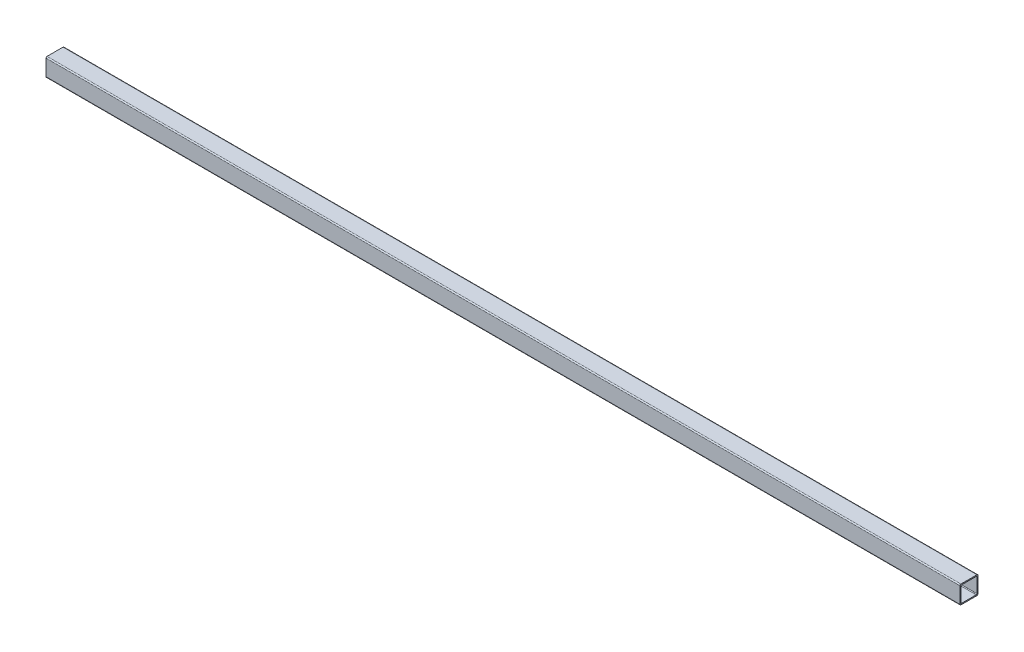
ISO-10303-21;
HEADER;
FILE_DESCRIPTION(('STEP AP214'),'2;1');
FILE_NAME('part.step','',(''),(''),'','','');
FILE_SCHEMA(('AUTOMOTIVE_DESIGN { 1 0 10303 214 1 1 1 1 }'));
ENDSEC;
DATA;
#1=APPLICATION_CONTEXT('core data for automotive mechanical design processes');
#2=APPLICATION_PROTOCOL_DEFINITION('international standard','automotive_design',2000,#1);
#3=PRODUCT_CONTEXT('',#1,'mechanical');
#4=PRODUCT('Part','Part','',(#3));
#5=PRODUCT_RELATED_PRODUCT_CATEGORY('part','',(#4));
#6=PRODUCT_DEFINITION_FORMATION('','',#4);
#7=PRODUCT_DEFINITION_CONTEXT('part definition',#1,'design');
#8=PRODUCT_DEFINITION('design','',#6,#7);
#9=PRODUCT_DEFINITION_SHAPE('','',#8);
#10=(LENGTH_UNIT() NAMED_UNIT(*) SI_UNIT(.MILLI.,.METRE.));
#11=(NAMED_UNIT(*) PLANE_ANGLE_UNIT() SI_UNIT($,.RADIAN.));
#12=(NAMED_UNIT(*) SI_UNIT($,.STERADIAN.) SOLID_ANGLE_UNIT());
#13=UNCERTAINTY_MEASURE_WITH_UNIT(LENGTH_MEASURE(1.E-05),#10,'distance_accuracy_value','');
#14=(GEOMETRIC_REPRESENTATION_CONTEXT(3) GLOBAL_UNCERTAINTY_ASSIGNED_CONTEXT((#13)) GLOBAL_UNIT_ASSIGNED_CONTEXT((#10,
#11,#12)) REPRESENTATION_CONTEXT('',''));
#15=CARTESIAN_POINT('',(0.,0.,0.));
#16=DIRECTION('',(0.,0.,1.));
#17=DIRECTION('',(1.,0.,0.));
#18=AXIS2_PLACEMENT_3D('',#15,#16,#17);
#19=CARTESIAN_POINT('',(0.,2466.,6.00000000000023));
#20=DIRECTION('',(-1.,0.,0.));
#21=DIRECTION('',(0.,0.,1.));
#22=AXIS2_PLACEMENT_3D('',#19,#20,#21);
#23=PLANE('',#22);
#24=CARTESIAN_POINT('',(0.,2466.,6.00000000000023));
#25=DIRECTION('',(-1.,0.,0.));
#26=DIRECTION('',(0.,0.,1.));
#27=AXIS2_PLACEMENT_3D('',#24,#25,#26);
#28=CIRCLE('',#27,6.00000000000023);
#29=CARTESIAN_POINT('',(0.,2466.,0.));
#30=VERTEX_POINT('',#29);
#31=CARTESIAN_POINT('',(0.,2460.,6.00000000000023));
#32=VERTEX_POINT('',#31);
#33=EDGE_CURVE('E213',#30,#32,#28,.T.);
#34=ORIENTED_EDGE('',*,*,#33,.T.);
#35=DIRECTION('',(0.,0.,1.));
#36=VECTOR('',#35,1.);
#37=CARTESIAN_POINT('',(0.,2460.,6.00000000000023));
#38=LINE('',#37,#36);
#39=CARTESIAN_POINT('',(0.,2460.,93.9999999999994));
#40=VERTEX_POINT('',#39);
#41=EDGE_CURVE('E216',#32,#40,#38,.T.);
#42=ORIENTED_EDGE('',*,*,#41,.T.);
#43=CARTESIAN_POINT('',(0.,2466.,93.9999999999994));
#44=DIRECTION('',(-1.,0.,0.));
#45=DIRECTION('',(0.,0.,1.));
#46=AXIS2_PLACEMENT_3D('',#43,#44,#45);
#47=CIRCLE('',#46,6.00000000000023);
#48=CARTESIAN_POINT('',(0.,2466.,99.9999999999996));
#49=VERTEX_POINT('',#48);
#50=EDGE_CURVE('E219',#40,#49,#47,.T.);
#51=ORIENTED_EDGE('',*,*,#50,.T.);
#52=DIRECTION('',(0.,1.,0.));
#53=VECTOR('',#52,1.);
#54=CARTESIAN_POINT('',(0.,2554.,99.9999999999996));
#55=LINE('',#54,#53);
#56=CARTESIAN_POINT('',(0.,2554.,99.9999999999994));
#57=VERTEX_POINT('',#56);
#58=EDGE_CURVE('E221',#49,#57,#55,.T.);
#59=ORIENTED_EDGE('',*,*,#58,.T.);
#60=CARTESIAN_POINT('',(0.,2554.,93.9999999999994));
#61=DIRECTION('',(-1.,0.,0.));
#62=DIRECTION('',(0.,0.,-1.));
#63=AXIS2_PLACEMENT_3D('',#60,#61,#62);
#64=CIRCLE('',#63,6.00000000000001);
#65=CARTESIAN_POINT('',(0.,2560.,93.9999999999994));
#66=VERTEX_POINT('',#65);
#67=EDGE_CURVE('E223',#57,#66,#64,.T.);
#68=ORIENTED_EDGE('',*,*,#67,.T.);
#69=DIRECTION('',(0.,0.,-1.));
#70=VECTOR('',#69,1.);
#71=CARTESIAN_POINT('',(0.,2560.,6.00000000000023));
#72=LINE('',#71,#70);
#73=CARTESIAN_POINT('',(0.,2560.,6.00000000000023));
#74=VERTEX_POINT('',#73);
#75=EDGE_CURVE('E225',#66,#74,#72,.T.);
#76=ORIENTED_EDGE('',*,*,#75,.T.);
#77=CARTESIAN_POINT('',(0.,2554.,6.00000000000023));
#78=DIRECTION('',(-1.,0.,0.));
#79=DIRECTION('',(0.,0.,1.));
#80=AXIS2_PLACEMENT_3D('',#77,#78,#79);
#81=CIRCLE('',#80,6.00000000000001);
#82=CARTESIAN_POINT('',(0.,2554.,0.));
#83=VERTEX_POINT('',#82);
#84=EDGE_CURVE('E227',#74,#83,#81,.T.);
#85=ORIENTED_EDGE('',*,*,#84,.T.);
#86=DIRECTION('',(0.,-1.,0.));
#87=VECTOR('',#86,1.);
#88=CARTESIAN_POINT('',(0.,2554.,0.));
#89=LINE('',#88,#87);
#90=EDGE_CURVE('E229',#83,#30,#89,.T.);
#91=ORIENTED_EDGE('',*,*,#90,.T.);
#92=EDGE_LOOP('',(#34,#42,#51,#59,#68,#76,#85,#91));
#93=FACE_BOUND('',#92,.T.);
#94=DIRECTION('',(0.,0.,1.));
#95=VECTOR('',#94,1.);
#96=CARTESIAN_POINT('',(0.,2466.,9.9999999999989));
#97=LINE('',#96,#95);
#98=CARTESIAN_POINT('',(0.,2466.,9.9999999999989));
#99=VERTEX_POINT('',#98);
#100=CARTESIAN_POINT('',(0.,2466.,90.0000000000007));
#101=VERTEX_POINT('',#100);
#102=EDGE_CURVE('E156',#99,#101,#97,.T.);
#103=ORIENTED_EDGE('',*,*,#102,.F.);
#104=CARTESIAN_POINT('',(0.,2470.,9.9999999999989));
#105=DIRECTION('',(-1.,0.,0.));
#106=DIRECTION('',(0.,0.,1.));
#107=AXIS2_PLACEMENT_3D('',#104,#105,#106);
#108=CIRCLE('',#107,3.99999999999978);
#109=CARTESIAN_POINT('',(0.,2470.,5.99999999999934));
#110=VERTEX_POINT('',#109);
#111=EDGE_CURVE('E148',#110,#99,#108,.T.);
#112=ORIENTED_EDGE('',*,*,#111,.F.);
#113=DIRECTION('',(0.,-1.,0.));
#114=VECTOR('',#113,1.);
#115=CARTESIAN_POINT('',(0.,2550.,5.99999999999934));
#116=LINE('',#115,#114);
#117=CARTESIAN_POINT('',(0.,2550.,5.99999999999934));
#118=VERTEX_POINT('',#117);
#119=EDGE_CURVE('E181',#118,#110,#116,.T.);
#120=ORIENTED_EDGE('',*,*,#119,.F.);
#121=CARTESIAN_POINT('',(0.,2550.,9.9999999999989));
#122=DIRECTION('',(-1.,0.,0.));
#123=DIRECTION('',(0.,0.,1.));
#124=AXIS2_PLACEMENT_3D('',#121,#122,#123);
#125=CIRCLE('',#124,3.99999999999978);
#126=CARTESIAN_POINT('',(0.,2554.,9.9999999999989));
#127=VERTEX_POINT('',#126);
#128=EDGE_CURVE('E179',#127,#118,#125,.T.);
#129=ORIENTED_EDGE('',*,*,#128,.F.);
#130=DIRECTION('',(0.,0.,-1.));
#131=VECTOR('',#130,1.);
#132=CARTESIAN_POINT('',(0.,2554.,9.9999999999989));
#133=LINE('',#132,#131);
#134=CARTESIAN_POINT('',(0.,2554.,90.0000000000007));
#135=VERTEX_POINT('',#134);
#136=EDGE_CURVE('E177',#135,#127,#133,.T.);
#137=ORIENTED_EDGE('',*,*,#136,.F.);
#138=CARTESIAN_POINT('',(0.,2550.,90.0000000000007));
#139=DIRECTION('',(-1.,0.,0.));
#140=DIRECTION('',(0.,0.,-1.));
#141=AXIS2_PLACEMENT_3D('',#138,#139,#140);
#142=CIRCLE('',#141,3.99999999999978);
#143=CARTESIAN_POINT('',(0.,2550.,94.0000000000005));
#144=VERTEX_POINT('',#143);
#145=EDGE_CURVE('E175',#144,#135,#142,.T.);
#146=ORIENTED_EDGE('',*,*,#145,.F.);
#147=DIRECTION('',(0.,1.,0.));
#148=VECTOR('',#147,1.);
#149=CARTESIAN_POINT('',(0.,2550.,94.0000000000003));
#150=LINE('',#149,#148);
#151=CARTESIAN_POINT('',(0.,2470.,94.0000000000003));
#152=VERTEX_POINT('',#151);
#153=EDGE_CURVE('E171',#152,#144,#150,.T.);
#154=ORIENTED_EDGE('',*,*,#153,.F.);
#155=CARTESIAN_POINT('',(0.,2470.,90.0000000000007));
#156=DIRECTION('',(-1.,0.,0.));
#157=DIRECTION('',(0.,0.,1.));
#158=AXIS2_PLACEMENT_3D('',#155,#156,#157);
#159=CIRCLE('',#158,3.99999999999978);
#160=EDGE_CURVE('E169',#101,#152,#159,.T.);
#161=ORIENTED_EDGE('',*,*,#160,.F.);
#162=EDGE_LOOP('',(#103,#112,#120,#129,#137,#146,#154,#161));
#163=FACE_BOUND('',#162,.T.);
#164=ADVANCED_FACE('F35',(#93,#163),#23,.T.);
#165=CARTESIAN_POINT('',(5050.,2466.,6.00000000000023));
#166=DIRECTION('',(-1.,0.,0.));
#167=DIRECTION('',(0.,0.,1.));
#168=AXIS2_PLACEMENT_3D('',#165,#166,#167);
#169=PLANE('',#168);
#170=CARTESIAN_POINT('',(5050.,2466.,6.00000000000023));
#171=DIRECTION('',(-1.,0.,0.));
#172=DIRECTION('',(0.,0.,1.));
#173=AXIS2_PLACEMENT_3D('',#170,#171,#172);
#174=CIRCLE('',#173,6.00000000000023);
#175=CARTESIAN_POINT('',(5050.,2466.,0.));
#176=VERTEX_POINT('',#175);
#177=CARTESIAN_POINT('',(5050.,2460.,6.00000000000023));
#178=VERTEX_POINT('',#177);
#179=EDGE_CURVE('E164',#176,#178,#174,.T.);
#180=ORIENTED_EDGE('',*,*,#179,.F.);
#181=DIRECTION('',(0.,-1.,0.));
#182=VECTOR('',#181,1.);
#183=CARTESIAN_POINT('',(5050.,2554.,0.));
#184=LINE('',#183,#182);
#185=CARTESIAN_POINT('',(5050.,2554.,0.));
#186=VERTEX_POINT('',#185);
#187=EDGE_CURVE('E217',#186,#176,#184,.T.);
#188=ORIENTED_EDGE('',*,*,#187,.F.);
#189=CARTESIAN_POINT('',(5050.,2554.,6.00000000000023));
#190=DIRECTION('',(-1.,0.,0.));
#191=DIRECTION('',(0.,0.,1.));
#192=AXIS2_PLACEMENT_3D('',#189,#190,#191);
#193=CIRCLE('',#192,6.00000000000001);
#194=CARTESIAN_POINT('',(5050.,2560.,6.00000000000023));
#195=VERTEX_POINT('',#194);
#196=EDGE_CURVE('E244',#195,#186,#193,.T.);
#197=ORIENTED_EDGE('',*,*,#196,.F.);
#198=DIRECTION('',(0.,0.,-1.));
#199=VECTOR('',#198,1.);
#200=CARTESIAN_POINT('',(5050.,2560.,6.00000000000023));
#201=LINE('',#200,#199);
#202=CARTESIAN_POINT('',(5050.,2560.,93.9999999999994));
#203=VERTEX_POINT('',#202);
#204=EDGE_CURVE('E242',#203,#195,#201,.T.);
#205=ORIENTED_EDGE('',*,*,#204,.F.);
#206=CARTESIAN_POINT('',(5050.,2554.,93.9999999999994));
#207=DIRECTION('',(-1.,0.,0.));
#208=DIRECTION('',(0.,0.,-1.));
#209=AXIS2_PLACEMENT_3D('',#206,#207,#208);
#210=CIRCLE('',#209,6.00000000000001);
#211=CARTESIAN_POINT('',(5050.,2554.,99.9999999999994));
#212=VERTEX_POINT('',#211);
#213=EDGE_CURVE('E240',#212,#203,#210,.T.);
#214=ORIENTED_EDGE('',*,*,#213,.F.);
#215=DIRECTION('',(0.,1.,0.));
#216=VECTOR('',#215,1.);
#217=CARTESIAN_POINT('',(5050.,2554.,99.9999999999996));
#218=LINE('',#217,#216);
#219=CARTESIAN_POINT('',(5050.,2466.,99.9999999999996));
#220=VERTEX_POINT('',#219);
#221=EDGE_CURVE('E238',#220,#212,#218,.T.);
#222=ORIENTED_EDGE('',*,*,#221,.F.);
#223=CARTESIAN_POINT('',(5050.,2466.,93.9999999999994));
#224=DIRECTION('',(-1.,0.,0.));
#225=DIRECTION('',(0.,0.,1.));
#226=AXIS2_PLACEMENT_3D('',#223,#224,#225);
#227=CIRCLE('',#226,6.00000000000023);
#228=CARTESIAN_POINT('',(5050.,2460.,93.9999999999994));
#229=VERTEX_POINT('',#228);
#230=EDGE_CURVE('E236',#229,#220,#227,.T.);
#231=ORIENTED_EDGE('',*,*,#230,.F.);
#232=DIRECTION('',(0.,0.,1.));
#233=VECTOR('',#232,1.);
#234=CARTESIAN_POINT('',(5050.,2460.,6.00000000000023));
#235=LINE('',#234,#233);
#236=EDGE_CURVE('E234',#178,#229,#235,.T.);
#237=ORIENTED_EDGE('',*,*,#236,.F.);
#238=EDGE_LOOP('',(#180,#188,#197,#205,#214,#222,#231,#237));
#239=FACE_BOUND('',#238,.T.);
#240=CARTESIAN_POINT('',(5050.,2470.,9.9999999999989));
#241=DIRECTION('',(-1.,0.,0.));
#242=DIRECTION('',(0.,0.,1.));
#243=AXIS2_PLACEMENT_3D('',#240,#241,#242);
#244=CIRCLE('',#243,3.99999999999978);
#245=CARTESIAN_POINT('',(5050.,2470.,5.99999999999934));
#246=VERTEX_POINT('',#245);
#247=CARTESIAN_POINT('',(5050.,2466.,9.9999999999989));
#248=VERTEX_POINT('',#247);
#249=EDGE_CURVE('E58',#246,#248,#244,.T.);
#250=ORIENTED_EDGE('',*,*,#249,.T.);
#251=DIRECTION('',(0.,0.,1.));
#252=VECTOR('',#251,1.);
#253=CARTESIAN_POINT('',(5050.,2466.,9.9999999999989));
#254=LINE('',#253,#252);
#255=CARTESIAN_POINT('',(5050.,2466.,90.0000000000007));
#256=VERTEX_POINT('',#255);
#257=EDGE_CURVE('E163',#248,#256,#254,.T.);
#258=ORIENTED_EDGE('',*,*,#257,.T.);
#259=CARTESIAN_POINT('',(5050.,2470.,90.0000000000007));
#260=DIRECTION('',(-1.,0.,0.));
#261=DIRECTION('',(0.,0.,1.));
#262=AXIS2_PLACEMENT_3D('',#259,#260,#261);
#263=CIRCLE('',#262,3.99999999999978);
#264=CARTESIAN_POINT('',(5050.,2470.,94.0000000000003));
#265=VERTEX_POINT('',#264);
#266=EDGE_CURVE('E185',#256,#265,#263,.T.);
#267=ORIENTED_EDGE('',*,*,#266,.T.);
#268=DIRECTION('',(0.,1.,0.));
#269=VECTOR('',#268,1.);
#270=CARTESIAN_POINT('',(5050.,2550.,94.0000000000003));
#271=LINE('',#270,#269);
#272=CARTESIAN_POINT('',(5050.,2550.,94.0000000000005));
#273=VERTEX_POINT('',#272);
#274=EDGE_CURVE('E188',#265,#273,#271,.T.);
#275=ORIENTED_EDGE('',*,*,#274,.T.);
#276=CARTESIAN_POINT('',(5050.,2550.,90.0000000000007));
#277=DIRECTION('',(-1.,0.,0.));
#278=DIRECTION('',(0.,0.,-1.));
#279=AXIS2_PLACEMENT_3D('',#276,#277,#278);
#280=CIRCLE('',#279,3.99999999999978);
#281=CARTESIAN_POINT('',(5050.,2554.,90.0000000000007));
#282=VERTEX_POINT('',#281);
#283=EDGE_CURVE('E191',#273,#282,#280,.T.);
#284=ORIENTED_EDGE('',*,*,#283,.T.);
#285=DIRECTION('',(0.,0.,-1.));
#286=VECTOR('',#285,1.);
#287=CARTESIAN_POINT('',(5050.,2554.,9.9999999999989));
#288=LINE('',#287,#286);
#289=CARTESIAN_POINT('',(5050.,2554.,9.9999999999989));
#290=VERTEX_POINT('',#289);
#291=EDGE_CURVE('E194',#282,#290,#288,.T.);
#292=ORIENTED_EDGE('',*,*,#291,.T.);
#293=CARTESIAN_POINT('',(5050.,2550.,9.9999999999989));
#294=DIRECTION('',(-1.,0.,0.));
#295=DIRECTION('',(0.,0.,1.));
#296=AXIS2_PLACEMENT_3D('',#293,#294,#295);
#297=CIRCLE('',#296,3.99999999999978);
#298=CARTESIAN_POINT('',(5050.,2550.,5.99999999999934));
#299=VERTEX_POINT('',#298);
#300=EDGE_CURVE('E197',#290,#299,#297,.T.);
#301=ORIENTED_EDGE('',*,*,#300,.T.);
#302=DIRECTION('',(0.,-1.,0.));
#303=VECTOR('',#302,1.);
#304=CARTESIAN_POINT('',(5050.,2550.,5.99999999999934));
#305=LINE('',#304,#303);
#306=EDGE_CURVE('E157',#299,#246,#305,.T.);
#307=ORIENTED_EDGE('',*,*,#306,.T.);
#308=EDGE_LOOP('',(#250,#258,#267,#275,#284,#292,#301,#307));
#309=FACE_BOUND('',#308,.T.);
#310=ADVANCED_FACE('F274',(#239,#309),#169,.F.);
#311=CARTESIAN_POINT('',(0.,2466.,6.00000000000023));
#312=DIRECTION('',(1.,0.,0.));
#313=DIRECTION('',(0.,0.,-1.));
#314=AXIS2_PLACEMENT_3D('',#311,#312,#313);
#315=CYLINDRICAL_SURFACE('',#314,6.00000000000023);
#316=ORIENTED_EDGE('',*,*,#179,.T.);
#317=DIRECTION('',(1.,0.,0.));
#318=VECTOR('',#317,1.);
#319=CARTESIAN_POINT('',(0.,2460.,6.00000000000023));
#320=LINE('',#319,#318);
#321=EDGE_CURVE('E11',#32,#178,#320,.T.);
#322=ORIENTED_EDGE('',*,*,#321,.F.);
#323=ORIENTED_EDGE('',*,*,#33,.F.);
#324=DIRECTION('',(1.,0.,0.));
#325=VECTOR('',#324,1.);
#326=CARTESIAN_POINT('',(0.,2466.,0.));
#327=LINE('',#326,#325);
#328=EDGE_CURVE('E231',#30,#176,#327,.T.);
#329=ORIENTED_EDGE('',*,*,#328,.T.);
#330=EDGE_LOOP('',(#316,#322,#323,#329));
#331=FACE_BOUND('',#330,.T.);
#332=ADVANCED_FACE('F37',(#331),#315,.T.);
#333=CARTESIAN_POINT('',(0.,2460.,6.00000000000023));
#334=DIRECTION('',(0.,1.,0.));
#335=DIRECTION('',(0.,0.,1.));
#336=AXIS2_PLACEMENT_3D('',#333,#334,#335);
#337=PLANE('',#336);
#338=ORIENTED_EDGE('',*,*,#236,.T.);
#339=DIRECTION('',(1.,0.,0.));
#340=VECTOR('',#339,1.);
#341=CARTESIAN_POINT('',(0.,2460.,93.9999999999994));
#342=LINE('',#341,#340);
#343=EDGE_CURVE('E43',#40,#229,#342,.T.);
#344=ORIENTED_EDGE('',*,*,#343,.F.);
#345=ORIENTED_EDGE('',*,*,#41,.F.);
#346=ORIENTED_EDGE('',*,*,#321,.T.);
#347=EDGE_LOOP('',(#338,#344,#345,#346));
#348=FACE_BOUND('',#347,.T.);
#349=ADVANCED_FACE('F291',(#348),#337,.F.);
#350=CARTESIAN_POINT('',(0.,2466.,93.9999999999994));
#351=DIRECTION('',(1.,0.,0.));
#352=DIRECTION('',(0.,0.,-1.));
#353=AXIS2_PLACEMENT_3D('',#350,#351,#352);
#354=CYLINDRICAL_SURFACE('',#353,6.00000000000023);
#355=ORIENTED_EDGE('',*,*,#230,.T.);
#356=DIRECTION('',(1.,0.,0.));
#357=VECTOR('',#356,1.);
#358=CARTESIAN_POINT('',(0.,2466.,99.9999999999996));
#359=LINE('',#358,#357);
#360=EDGE_CURVE('E261',#49,#220,#359,.T.);
#361=ORIENTED_EDGE('',*,*,#360,.F.);
#362=ORIENTED_EDGE('',*,*,#50,.F.);
#363=ORIENTED_EDGE('',*,*,#343,.T.);
#364=EDGE_LOOP('',(#355,#361,#362,#363));
#365=FACE_BOUND('',#364,.T.);
#366=ADVANCED_FACE('F268',(#365),#354,.T.);
#367=CARTESIAN_POINT('',(0.,2554.,99.9999999999996));
#368=DIRECTION('',(0.,0.,-1.));
#369=DIRECTION('',(-1.,0.,0.));
#370=AXIS2_PLACEMENT_3D('',#367,#368,#369);
#371=PLANE('',#370);
#372=ORIENTED_EDGE('',*,*,#221,.T.);
#373=DIRECTION('',(1.,0.,0.));
#374=VECTOR('',#373,1.);
#375=CARTESIAN_POINT('',(0.,2554.,99.9999999999994));
#376=LINE('',#375,#374);
#377=EDGE_CURVE('E258',#57,#212,#376,.T.);
#378=ORIENTED_EDGE('',*,*,#377,.F.);
#379=ORIENTED_EDGE('',*,*,#58,.F.);
#380=ORIENTED_EDGE('',*,*,#360,.T.);
#381=EDGE_LOOP('',(#372,#378,#379,#380));
#382=FACE_BOUND('',#381,.T.);
#383=ADVANCED_FACE('F280',(#382),#371,.F.);
#384=CARTESIAN_POINT('',(0.,2554.,93.9999999999994));
#385=DIRECTION('',(1.,0.,0.));
#386=DIRECTION('',(0.,0.,-1.));
#387=AXIS2_PLACEMENT_3D('',#384,#385,#386);
#388=CYLINDRICAL_SURFACE('',#387,6.00000000000001);
#389=ORIENTED_EDGE('',*,*,#213,.T.);
#390=DIRECTION('',(1.,0.,0.));
#391=VECTOR('',#390,1.);
#392=CARTESIAN_POINT('',(0.,2560.,93.9999999999994));
#393=LINE('',#392,#391);
#394=EDGE_CURVE('E255',#66,#203,#393,.T.);
#395=ORIENTED_EDGE('',*,*,#394,.F.);
#396=ORIENTED_EDGE('',*,*,#67,.F.);
#397=ORIENTED_EDGE('',*,*,#377,.T.);
#398=EDGE_LOOP('',(#389,#395,#396,#397));
#399=FACE_BOUND('',#398,.T.);
#400=ADVANCED_FACE('F284',(#399),#388,.T.);
#401=CARTESIAN_POINT('',(0.,2560.,6.00000000000023));
#402=DIRECTION('',(0.,-1.,0.));
#403=DIRECTION('',(0.,0.,-1.));
#404=AXIS2_PLACEMENT_3D('',#401,#402,#403);
#405=PLANE('',#404);
#406=ORIENTED_EDGE('',*,*,#204,.T.);
#407=DIRECTION('',(1.,0.,0.));
#408=VECTOR('',#407,1.);
#409=CARTESIAN_POINT('',(0.,2560.,6.00000000000023));
#410=LINE('',#409,#408);
#411=EDGE_CURVE('E252',#74,#195,#410,.T.);
#412=ORIENTED_EDGE('',*,*,#411,.F.);
#413=ORIENTED_EDGE('',*,*,#75,.F.);
#414=ORIENTED_EDGE('',*,*,#394,.T.);
#415=EDGE_LOOP('',(#406,#412,#413,#414));
#416=FACE_BOUND('',#415,.T.);
#417=ADVANCED_FACE('F304',(#416),#405,.F.);
#418=CARTESIAN_POINT('',(0.,2554.,6.00000000000023));
#419=DIRECTION('',(1.,0.,0.));
#420=DIRECTION('',(0.,0.,-1.));
#421=AXIS2_PLACEMENT_3D('',#418,#419,#420);
#422=CYLINDRICAL_SURFACE('',#421,6.00000000000001);
#423=ORIENTED_EDGE('',*,*,#196,.T.);
#424=DIRECTION('',(1.,0.,0.));
#425=VECTOR('',#424,1.);
#426=CARTESIAN_POINT('',(0.,2554.,0.));
#427=LINE('',#426,#425);
#428=EDGE_CURVE('E249',#83,#186,#427,.T.);
#429=ORIENTED_EDGE('',*,*,#428,.F.);
#430=ORIENTED_EDGE('',*,*,#84,.F.);
#431=ORIENTED_EDGE('',*,*,#411,.T.);
#432=EDGE_LOOP('',(#423,#429,#430,#431));
#433=FACE_BOUND('',#432,.T.);
#434=ADVANCED_FACE('F302',(#433),#422,.T.);
#435=CARTESIAN_POINT('',(0.,2554.,0.));
#436=DIRECTION('',(0.,0.,1.));
#437=DIRECTION('',(1.,0.,0.));
#438=AXIS2_PLACEMENT_3D('',#435,#436,#437);
#439=PLANE('',#438);
#440=ORIENTED_EDGE('',*,*,#187,.T.);
#441=ORIENTED_EDGE('',*,*,#328,.F.);
#442=ORIENTED_EDGE('',*,*,#90,.F.);
#443=ORIENTED_EDGE('',*,*,#428,.T.);
#444=EDGE_LOOP('',(#440,#441,#442,#443));
#445=FACE_BOUND('',#444,.T.);
#446=ADVANCED_FACE('F297',(#445),#439,.F.);
#447=CARTESIAN_POINT('',(0.,2470.,9.9999999999989));
#448=DIRECTION('',(1.,0.,0.));
#449=DIRECTION('',(0.,0.,-1.));
#450=AXIS2_PLACEMENT_3D('',#447,#448,#449);
#451=CYLINDRICAL_SURFACE('',#450,3.99999999999978);
#452=ORIENTED_EDGE('',*,*,#249,.F.);
#453=DIRECTION('',(1.,0.,0.));
#454=VECTOR('',#453,1.);
#455=CARTESIAN_POINT('',(0.,2470.,5.99999999999934));
#456=LINE('',#455,#454);
#457=EDGE_CURVE('E152',#110,#246,#456,.T.);
#458=ORIENTED_EDGE('',*,*,#457,.F.);
#459=ORIENTED_EDGE('',*,*,#111,.T.);
#460=DIRECTION('',(1.,0.,0.));
#461=VECTOR('',#460,1.);
#462=CARTESIAN_POINT('',(0.,2466.,9.9999999999989));
#463=LINE('',#462,#461);
#464=EDGE_CURVE('E151',#99,#248,#463,.T.);
#465=ORIENTED_EDGE('',*,*,#464,.T.);
#466=EDGE_LOOP('',(#452,#458,#459,#465));
#467=FACE_BOUND('',#466,.T.);
#468=ADVANCED_FACE('F150',(#467),#451,.F.);
#469=CARTESIAN_POINT('',(0.,2466.,9.9999999999989));
#470=DIRECTION('',(0.,1.,0.));
#471=DIRECTION('',(0.,0.,1.));
#472=AXIS2_PLACEMENT_3D('',#469,#470,#471);
#473=PLANE('',#472);
#474=ORIENTED_EDGE('',*,*,#257,.F.);
#475=ORIENTED_EDGE('',*,*,#464,.F.);
#476=ORIENTED_EDGE('',*,*,#102,.T.);
#477=DIRECTION('',(1.,0.,0.));
#478=VECTOR('',#477,1.);
#479=CARTESIAN_POINT('',(0.,2466.,90.0000000000007));
#480=LINE('',#479,#478);
#481=EDGE_CURVE('E165',#101,#256,#480,.T.);
#482=ORIENTED_EDGE('',*,*,#481,.T.);
#483=EDGE_LOOP('',(#474,#475,#476,#482));
#484=FACE_BOUND('',#483,.T.);
#485=ADVANCED_FACE('F160',(#484),#473,.T.);
#486=CARTESIAN_POINT('',(0.,2470.,90.0000000000007));
#487=DIRECTION('',(1.,0.,0.));
#488=DIRECTION('',(0.,0.,-1.));
#489=AXIS2_PLACEMENT_3D('',#486,#487,#488);
#490=CYLINDRICAL_SURFACE('',#489,3.99999999999978);
#491=ORIENTED_EDGE('',*,*,#266,.F.);
#492=ORIENTED_EDGE('',*,*,#481,.F.);
#493=ORIENTED_EDGE('',*,*,#160,.T.);
#494=DIRECTION('',(1.,0.,0.));
#495=VECTOR('',#494,1.);
#496=CARTESIAN_POINT('',(0.,2470.,94.0000000000003));
#497=LINE('',#496,#495);
#498=EDGE_CURVE('E210',#152,#265,#497,.T.);
#499=ORIENTED_EDGE('',*,*,#498,.T.);
#500=EDGE_LOOP('',(#491,#492,#493,#499));
#501=FACE_BOUND('',#500,.T.);
#502=ADVANCED_FACE('F329',(#501),#490,.F.);
#503=CARTESIAN_POINT('',(0.,2550.,94.0000000000003));
#504=DIRECTION('',(0.,0.,-1.));
#505=DIRECTION('',(-1.,0.,0.));
#506=AXIS2_PLACEMENT_3D('',#503,#504,#505);
#507=PLANE('',#506);
#508=ORIENTED_EDGE('',*,*,#274,.F.);
#509=ORIENTED_EDGE('',*,*,#498,.F.);
#510=ORIENTED_EDGE('',*,*,#153,.T.);
#511=DIRECTION('',(1.,0.,0.));
#512=VECTOR('',#511,1.);
#513=CARTESIAN_POINT('',(0.,2550.,94.0000000000005));
#514=LINE('',#513,#512);
#515=EDGE_CURVE('E208',#144,#273,#514,.T.);
#516=ORIENTED_EDGE('',*,*,#515,.T.);
#517=EDGE_LOOP('',(#508,#509,#510,#516));
#518=FACE_BOUND('',#517,.T.);
#519=ADVANCED_FACE('F333',(#518),#507,.T.);
#520=CARTESIAN_POINT('',(0.,2550.,90.0000000000007));
#521=DIRECTION('',(1.,0.,0.));
#522=DIRECTION('',(0.,0.,-1.));
#523=AXIS2_PLACEMENT_3D('',#520,#521,#522);
#524=CYLINDRICAL_SURFACE('',#523,3.99999999999978);
#525=ORIENTED_EDGE('',*,*,#283,.F.);
#526=ORIENTED_EDGE('',*,*,#515,.F.);
#527=ORIENTED_EDGE('',*,*,#145,.T.);
#528=DIRECTION('',(1.,0.,0.));
#529=VECTOR('',#528,1.);
#530=CARTESIAN_POINT('',(0.,2554.,90.0000000000007));
#531=LINE('',#530,#529);
#532=EDGE_CURVE('E206',#135,#282,#531,.T.);
#533=ORIENTED_EDGE('',*,*,#532,.T.);
#534=EDGE_LOOP('',(#525,#526,#527,#533));
#535=FACE_BOUND('',#534,.T.);
#536=ADVANCED_FACE('F339',(#535),#524,.F.);
#537=CARTESIAN_POINT('',(0.,2554.,9.9999999999989));
#538=DIRECTION('',(0.,-1.,0.));
#539=DIRECTION('',(0.,0.,-1.));
#540=AXIS2_PLACEMENT_3D('',#537,#538,#539);
#541=PLANE('',#540);
#542=ORIENTED_EDGE('',*,*,#291,.F.);
#543=ORIENTED_EDGE('',*,*,#532,.F.);
#544=ORIENTED_EDGE('',*,*,#136,.T.);
#545=DIRECTION('',(1.,0.,0.));
#546=VECTOR('',#545,1.);
#547=CARTESIAN_POINT('',(0.,2554.,9.9999999999989));
#548=LINE('',#547,#546);
#549=EDGE_CURVE('E204',#127,#290,#548,.T.);
#550=ORIENTED_EDGE('',*,*,#549,.T.);
#551=EDGE_LOOP('',(#542,#543,#544,#550));
#552=FACE_BOUND('',#551,.T.);
#553=ADVANCED_FACE('F343',(#552),#541,.T.);
#554=CARTESIAN_POINT('',(0.,2550.,9.9999999999989));
#555=DIRECTION('',(1.,0.,0.));
#556=DIRECTION('',(0.,0.,-1.));
#557=AXIS2_PLACEMENT_3D('',#554,#555,#556);
#558=CYLINDRICAL_SURFACE('',#557,3.99999999999978);
#559=ORIENTED_EDGE('',*,*,#300,.F.);
#560=ORIENTED_EDGE('',*,*,#549,.F.);
#561=ORIENTED_EDGE('',*,*,#128,.T.);
#562=DIRECTION('',(1.,0.,0.));
#563=VECTOR('',#562,1.);
#564=CARTESIAN_POINT('',(0.,2550.,5.99999999999934));
#565=LINE('',#564,#563);
#566=EDGE_CURVE('E50',#118,#299,#565,.T.);
#567=ORIENTED_EDGE('',*,*,#566,.T.);
#568=EDGE_LOOP('',(#559,#560,#561,#567));
#569=FACE_BOUND('',#568,.T.);
#570=ADVANCED_FACE('F347',(#569),#558,.F.);
#571=CARTESIAN_POINT('',(0.,2550.,5.99999999999934));
#572=DIRECTION('',(0.,0.,1.));
#573=DIRECTION('',(1.,0.,0.));
#574=AXIS2_PLACEMENT_3D('',#571,#572,#573);
#575=PLANE('',#574);
#576=ORIENTED_EDGE('',*,*,#306,.F.);
#577=ORIENTED_EDGE('',*,*,#566,.F.);
#578=ORIENTED_EDGE('',*,*,#119,.T.);
#579=ORIENTED_EDGE('',*,*,#457,.T.);
#580=EDGE_LOOP('',(#576,#577,#578,#579));
#581=FACE_BOUND('',#580,.T.);
#582=ADVANCED_FACE('F351',(#581),#575,.T.);
#583=CLOSED_SHELL('',(#164,#310,#332,#349,#366,#383,#400,#417,#434,#446,#468,#485,#502,#519,
#536,#553,#570,#582));
#584=MANIFOLD_SOLID_BREP('B2',#583);
#585=ADVANCED_BREP_SHAPE_REPRESENTATION('',(#18,#584),#14);
#586=SHAPE_DEFINITION_REPRESENTATION(#9,#585);
ENDSEC;
END-ISO-10303-21;
